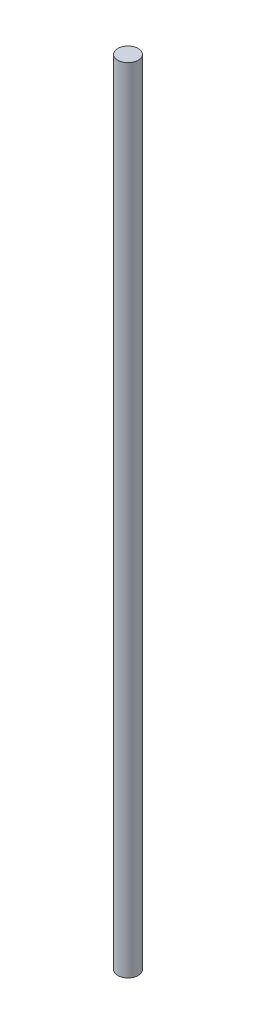
ISO-10303-21;
HEADER;
FILE_DESCRIPTION(('STEP AP214'),'2;1');
FILE_NAME('part.step','',(''),(''),'','','');
FILE_SCHEMA(('AUTOMOTIVE_DESIGN { 1 0 10303 214 1 1 1 1 }'));
ENDSEC;
DATA;
#1=APPLICATION_CONTEXT('core data for automotive mechanical design processes');
#2=APPLICATION_PROTOCOL_DEFINITION('international standard','automotive_design',2000,#1);
#3=PRODUCT_CONTEXT('',#1,'mechanical');
#4=PRODUCT('Part','Part','',(#3));
#5=PRODUCT_RELATED_PRODUCT_CATEGORY('part','',(#4));
#6=PRODUCT_DEFINITION_FORMATION('','',#4);
#7=PRODUCT_DEFINITION_CONTEXT('part definition',#1,'design');
#8=PRODUCT_DEFINITION('design','',#6,#7);
#9=PRODUCT_DEFINITION_SHAPE('','',#8);
#10=(LENGTH_UNIT() NAMED_UNIT(*) SI_UNIT(.MILLI.,.METRE.));
#11=(NAMED_UNIT(*) PLANE_ANGLE_UNIT() SI_UNIT($,.RADIAN.));
#12=(NAMED_UNIT(*) SI_UNIT($,.STERADIAN.) SOLID_ANGLE_UNIT());
#13=UNCERTAINTY_MEASURE_WITH_UNIT(LENGTH_MEASURE(1.E-05),#10,'distance_accuracy_value','');
#14=(GEOMETRIC_REPRESENTATION_CONTEXT(3) GLOBAL_UNCERTAINTY_ASSIGNED_CONTEXT((#13)) GLOBAL_UNIT_ASSIGNED_CONTEXT((#10,
#11,#12)) REPRESENTATION_CONTEXT('',''));
#15=CARTESIAN_POINT('',(0.,0.,0.));
#16=DIRECTION('',(0.,0.,1.));
#17=DIRECTION('',(1.,0.,0.));
#18=AXIS2_PLACEMENT_3D('',#15,#16,#17);
#19=CARTESIAN_POINT('',(0.,155.,0.));
#20=DIRECTION('',(0.,-1.,0.));
#21=DIRECTION('',(0.,0.,-1.));
#22=AXIS2_PLACEMENT_3D('',#19,#20,#21);
#23=CYLINDRICAL_SURFACE('',#22,4.);
#24=CARTESIAN_POINT('',(0.,155.,0.));
#25=DIRECTION('',(0.,1.,0.));
#26=DIRECTION('',(0.,0.,1.));
#27=AXIS2_PLACEMENT_3D('',#24,#25,#26);
#28=CIRCLE('',#27,4.);
#29=CARTESIAN_POINT('',(0.,155.,4.));
#30=VERTEX_POINT('',#29);
#31=EDGE_CURVE('E12',#30,#30,#28,.T.);
#32=ORIENTED_EDGE('',*,*,#31,.F.);
#33=EDGE_LOOP('',(#32));
#34=FACE_BOUND('',#33,.T.);
#35=CARTESIAN_POINT('',(0.,-155.,0.));
#36=DIRECTION('',(0.,1.,0.));
#37=DIRECTION('',(0.,0.,1.));
#38=AXIS2_PLACEMENT_3D('',#35,#36,#37);
#39=CIRCLE('',#38,4.);
#40=CARTESIAN_POINT('',(0.,-155.,4.));
#41=VERTEX_POINT('',#40);
#42=EDGE_CURVE('E45',#41,#41,#39,.T.);
#43=ORIENTED_EDGE('',*,*,#42,.T.);
#44=EDGE_LOOP('',(#43));
#45=FACE_BOUND('',#44,.T.);
#46=ADVANCED_FACE('F42',(#34,#45),#23,.T.);
#47=CARTESIAN_POINT('',(0.,155.,0.));
#48=DIRECTION('',(0.,1.,0.));
#49=DIRECTION('',(0.,0.,1.));
#50=AXIS2_PLACEMENT_3D('',#47,#48,#49);
#51=PLANE('',#50);
#52=ORIENTED_EDGE('',*,*,#31,.T.);
#53=EDGE_LOOP('',(#52));
#54=FACE_BOUND('',#53,.T.);
#55=ADVANCED_FACE('F57',(#54),#51,.T.);
#56=CARTESIAN_POINT('',(0.,-155.,0.));
#57=DIRECTION('',(0.,1.,0.));
#58=DIRECTION('',(0.,0.,1.));
#59=AXIS2_PLACEMENT_3D('',#56,#57,#58);
#60=PLANE('',#59);
#61=ORIENTED_EDGE('',*,*,#42,.F.);
#62=EDGE_LOOP('',(#61));
#63=FACE_BOUND('',#62,.T.);
#64=ADVANCED_FACE('F55',(#63),#60,.F.);
#65=CLOSED_SHELL('',(#46,#55,#64));
#66=MANIFOLD_SOLID_BREP('B2',#65);
#67=ADVANCED_BREP_SHAPE_REPRESENTATION('',(#18,#66),#14);
#68=SHAPE_DEFINITION_REPRESENTATION(#9,#67);
ENDSEC;
END-ISO-10303-21;
